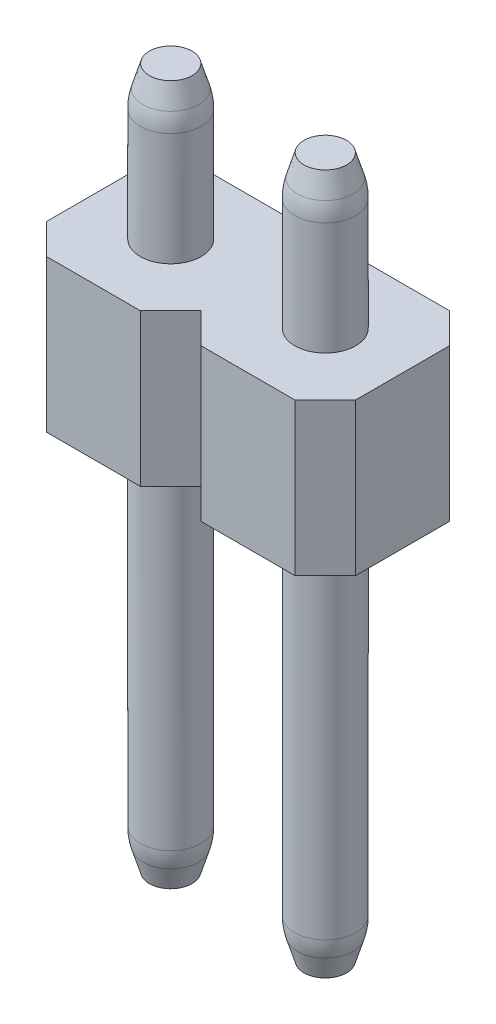
ISO-10303-21;
HEADER;
FILE_DESCRIPTION(('STEP AP214'),'2;1');
FILE_NAME('part.step','',(''),(''),'','','');
FILE_SCHEMA(('AUTOMOTIVE_DESIGN { 1 0 10303 214 1 1 1 1 }'));
ENDSEC;
DATA;
#1=APPLICATION_CONTEXT('core data for automotive mechanical design processes');
#2=APPLICATION_PROTOCOL_DEFINITION('international standard','automotive_design',2000,#1);
#3=PRODUCT_CONTEXT('',#1,'mechanical');
#4=PRODUCT('Part','Part','',(#3));
#5=PRODUCT_RELATED_PRODUCT_CATEGORY('part','',(#4));
#6=PRODUCT_DEFINITION_FORMATION('','',#4);
#7=PRODUCT_DEFINITION_CONTEXT('part definition',#1,'design');
#8=PRODUCT_DEFINITION('design','',#6,#7);
#9=PRODUCT_DEFINITION_SHAPE('','',#8);
#10=(LENGTH_UNIT() NAMED_UNIT(*) SI_UNIT(.MILLI.,.METRE.));
#11=(NAMED_UNIT(*) PLANE_ANGLE_UNIT() SI_UNIT($,.RADIAN.));
#12=(NAMED_UNIT(*) SI_UNIT($,.STERADIAN.) SOLID_ANGLE_UNIT());
#13=UNCERTAINTY_MEASURE_WITH_UNIT(LENGTH_MEASURE(1.E-05),#10,'distance_accuracy_value','');
#14=(GEOMETRIC_REPRESENTATION_CONTEXT(3) GLOBAL_UNCERTAINTY_ASSIGNED_CONTEXT((#13)) GLOBAL_UNIT_ASSIGNED_CONTEXT((#10,
#11,#12)) REPRESENTATION_CONTEXT('',''));
#15=CARTESIAN_POINT('',(0.,0.,0.));
#16=DIRECTION('',(0.,0.,1.));
#17=DIRECTION('',(1.,0.,0.));
#18=AXIS2_PLACEMENT_3D('',#15,#16,#17);
#19=CARTESIAN_POINT('',(0.,11.5,0.));
#20=DIRECTION('',(0.,-1.,0.));
#21=DIRECTION('',(0.,0.,-1.));
#22=AXIS2_PLACEMENT_3D('',#19,#20,#21);
#23=CYLINDRICAL_SURFACE('',#22,0.5);
#24=CARTESIAN_POINT('',(0.,10.8532311636965,0.));
#25=DIRECTION('',(0.,1.,0.));
#26=DIRECTION('',(0.,0.,1.));
#27=AXIS2_PLACEMENT_3D('',#24,#25,#26);
#28=CIRCLE('',#27,0.5);
#29=CARTESIAN_POINT('',(0.,10.8532311636965,0.5));
#30=VERTEX_POINT('',#29);
#31=EDGE_CURVE('E259',#30,#30,#28,.F.);
#32=ORIENTED_EDGE('',*,*,#31,.T.);
#33=EDGE_LOOP('',(#32));
#34=FACE_BOUND('',#33,.T.);
#35=CARTESIAN_POINT('',(0.,9.,0.));
#36=DIRECTION('',(0.,-1.,0.));
#37=DIRECTION('',(0.,0.,-1.));
#38=AXIS2_PLACEMENT_3D('',#35,#36,#37);
#39=CIRCLE('',#38,0.5);
#40=CARTESIAN_POINT('',(0.,9.,-0.5));
#41=VERTEX_POINT('',#40);
#42=EDGE_CURVE('E240',#41,#41,#39,.T.);
#43=ORIENTED_EDGE('',*,*,#42,.F.);
#44=EDGE_LOOP('',(#43));
#45=FACE_BOUND('',#44,.T.);
#46=ADVANCED_FACE('F50',(#34,#45),#23,.T.);
#47=CARTESIAN_POINT('',(0.,11.5,0.));
#48=DIRECTION('',(0.,1.,0.));
#49=DIRECTION('',(0.,0.,1.));
#50=AXIS2_PLACEMENT_3D('',#47,#48,#49);
#51=PLANE('',#50);
#52=CARTESIAN_POINT('',(0.,11.5,0.));
#53=DIRECTION('',(0.,1.,0.));
#54=DIRECTION('',(0.,0.,1.));
#55=AXIS2_PLACEMENT_3D('',#52,#53,#54);
#56=CIRCLE('',#55,0.350000000000005);
#57=CARTESIAN_POINT('',(0.,11.5,0.350000000000005));
#58=VERTEX_POINT('',#57);
#59=EDGE_CURVE('E250',#58,#58,#56,.T.);
#60=ORIENTED_EDGE('',*,*,#59,.T.);
#61=EDGE_LOOP('',(#60));
#62=FACE_BOUND('',#61,.T.);
#63=ADVANCED_FACE('F316',(#62),#51,.T.);
#64=CARTESIAN_POINT('',(-1.27,9.,0.77));
#65=DIRECTION('',(1.,0.,0.));
#66=DIRECTION('',(0.,0.,-1.));
#67=AXIS2_PLACEMENT_3D('',#64,#65,#66);
#68=PLANE('',#67);
#69=DIRECTION('',(0.,0.,1.));
#70=VECTOR('',#69,1.);
#71=CARTESIAN_POINT('',(-1.27,6.5,0.77));
#72=LINE('',#71,#70);
#73=CARTESIAN_POINT('',(-1.27,6.5,-0.77));
#74=VERTEX_POINT('',#73);
#75=CARTESIAN_POINT('',(-1.27,6.5,0.77));
#76=VERTEX_POINT('',#75);
#77=EDGE_CURVE('E179',#74,#76,#72,.T.);
#78=ORIENTED_EDGE('',*,*,#77,.T.);
#79=DIRECTION('',(0.,-1.,0.));
#80=VECTOR('',#79,1.);
#81=CARTESIAN_POINT('',(-1.27,9.,0.77));
#82=LINE('',#81,#80);
#83=CARTESIAN_POINT('',(-1.27,9.,0.77));
#84=VERTEX_POINT('',#83);
#85=EDGE_CURVE('E235',#84,#76,#82,.T.);
#86=ORIENTED_EDGE('',*,*,#85,.F.);
#87=DIRECTION('',(0.,0.,1.));
#88=VECTOR('',#87,1.);
#89=CARTESIAN_POINT('',(-1.27,9.,0.77));
#90=LINE('',#89,#88);
#91=CARTESIAN_POINT('',(-1.27,9.,-0.77));
#92=VERTEX_POINT('',#91);
#93=EDGE_CURVE('E205',#92,#84,#90,.T.);
#94=ORIENTED_EDGE('',*,*,#93,.F.);
#95=DIRECTION('',(0.,-1.,0.));
#96=VECTOR('',#95,1.);
#97=CARTESIAN_POINT('',(-1.27,9.,-0.77));
#98=LINE('',#97,#96);
#99=EDGE_CURVE('E175',#92,#74,#98,.T.);
#100=ORIENTED_EDGE('',*,*,#99,.T.);
#101=EDGE_LOOP('',(#78,#86,#94,#100));
#102=FACE_BOUND('',#101,.T.);
#103=ADVANCED_FACE('F321',(#102),#68,.F.);
#104=CARTESIAN_POINT('',(-1.27,9.,0.77));
#105=DIRECTION('',(0.707106781186548,0.,-0.707106781186548));
#106=DIRECTION('',(-0.707106781186548,0.,-0.707106781186548));
#107=AXIS2_PLACEMENT_3D('',#104,#105,#106);
#108=PLANE('',#107);
#109=DIRECTION('',(0.707106781186548,0.,0.707106781186548));
#110=VECTOR('',#109,1.);
#111=CARTESIAN_POINT('',(-1.27,6.5,0.77));
#112=LINE('',#111,#110);
#113=CARTESIAN_POINT('',(-0.77,6.5,1.27));
#114=VERTEX_POINT('',#113);
#115=EDGE_CURVE('E182',#76,#114,#112,.T.);
#116=ORIENTED_EDGE('',*,*,#115,.T.);
#117=DIRECTION('',(0.,-1.,0.));
#118=VECTOR('',#117,1.);
#119=CARTESIAN_POINT('',(-0.77,9.,1.27));
#120=LINE('',#119,#118);
#121=CARTESIAN_POINT('',(-0.77,9.,1.27));
#122=VERTEX_POINT('',#121);
#123=EDGE_CURVE('E232',#122,#114,#120,.T.);
#124=ORIENTED_EDGE('',*,*,#123,.F.);
#125=DIRECTION('',(0.707106781186548,0.,0.707106781186548));
#126=VECTOR('',#125,1.);
#127=CARTESIAN_POINT('',(-1.27,9.,0.77));
#128=LINE('',#127,#126);
#129=EDGE_CURVE('E127',#84,#122,#128,.T.);
#130=ORIENTED_EDGE('',*,*,#129,.F.);
#131=ORIENTED_EDGE('',*,*,#85,.T.);
#132=EDGE_LOOP('',(#116,#124,#130,#131));
#133=FACE_BOUND('',#132,.T.);
#134=ADVANCED_FACE('F415',(#133),#108,.F.);
#135=CARTESIAN_POINT('',(-0.77,9.,1.27));
#136=DIRECTION('',(0.,0.,-1.));
#137=DIRECTION('',(-1.,0.,0.));
#138=AXIS2_PLACEMENT_3D('',#135,#136,#137);
#139=PLANE('',#138);
#140=DIRECTION('',(1.,0.,0.));
#141=VECTOR('',#140,1.);
#142=CARTESIAN_POINT('',(-0.77,6.5,1.27));
#143=LINE('',#142,#141);
#144=CARTESIAN_POINT('',(0.77,6.5,1.27));
#145=VERTEX_POINT('',#144);
#146=EDGE_CURVE('E185',#114,#145,#143,.T.);
#147=ORIENTED_EDGE('',*,*,#146,.T.);
#148=DIRECTION('',(0.,-1.,0.));
#149=VECTOR('',#148,1.);
#150=CARTESIAN_POINT('',(0.77,9.,1.27));
#151=LINE('',#150,#149);
#152=CARTESIAN_POINT('',(0.77,9.,1.27));
#153=VERTEX_POINT('',#152);
#154=EDGE_CURVE('E229',#153,#145,#151,.T.);
#155=ORIENTED_EDGE('',*,*,#154,.F.);
#156=DIRECTION('',(1.,0.,0.));
#157=VECTOR('',#156,1.);
#158=CARTESIAN_POINT('',(-0.77,9.,1.27));
#159=LINE('',#158,#157);
#160=EDGE_CURVE('E412',#122,#153,#159,.T.);
#161=ORIENTED_EDGE('',*,*,#160,.F.);
#162=ORIENTED_EDGE('',*,*,#123,.T.);
#163=EDGE_LOOP('',(#147,#155,#161,#162));
#164=FACE_BOUND('',#163,.T.);
#165=ADVANCED_FACE('F411',(#164),#139,.F.);
#166=CARTESIAN_POINT('',(0.77,9.,1.27));
#167=DIRECTION('',(-0.707106781186548,0.,-0.707106781186548));
#168=DIRECTION('',(-0.707106781186548,0.,0.707106781186548));
#169=AXIS2_PLACEMENT_3D('',#166,#167,#168);
#170=PLANE('',#169);
#171=DIRECTION('',(0.707106781186548,0.,-0.707106781186548));
#172=VECTOR('',#171,1.);
#173=CARTESIAN_POINT('',(0.77,6.5,1.27));
#174=LINE('',#173,#172);
#175=CARTESIAN_POINT('',(1.27,6.5,0.77));
#176=VERTEX_POINT('',#175);
#177=EDGE_CURVE('E187',#145,#176,#174,.T.);
#178=ORIENTED_EDGE('',*,*,#177,.T.);
#179=DIRECTION('',(0.,-1.,0.));
#180=VECTOR('',#179,1.);
#181=CARTESIAN_POINT('',(1.27,9.,0.77));
#182=LINE('',#181,#180);
#183=CARTESIAN_POINT('',(1.27,9.,0.77));
#184=VERTEX_POINT('',#183);
#185=EDGE_CURVE('E226',#184,#176,#182,.T.);
#186=ORIENTED_EDGE('',*,*,#185,.F.);
#187=DIRECTION('',(0.707106781186548,0.,-0.707106781186548));
#188=VECTOR('',#187,1.);
#189=CARTESIAN_POINT('',(0.77,9.,1.27));
#190=LINE('',#189,#188);
#191=EDGE_CURVE('E407',#153,#184,#190,.T.);
#192=ORIENTED_EDGE('',*,*,#191,.F.);
#193=ORIENTED_EDGE('',*,*,#154,.T.);
#194=EDGE_LOOP('',(#178,#186,#192,#193));
#195=FACE_BOUND('',#194,.T.);
#196=ADVANCED_FACE('F406',(#195),#170,.F.);
#197=CARTESIAN_POINT('',(1.27,9.,0.77));
#198=DIRECTION('',(0.707106781186548,0.,-0.707106781186548));
#199=DIRECTION('',(-0.707106781186548,0.,-0.707106781186548));
#200=AXIS2_PLACEMENT_3D('',#197,#198,#199);
#201=PLANE('',#200);
#202=DIRECTION('',(0.707106781186548,0.,0.707106781186548));
#203=VECTOR('',#202,1.);
#204=CARTESIAN_POINT('',(1.27,6.5,0.77));
#205=LINE('',#204,#203);
#206=CARTESIAN_POINT('',(1.77,6.5,1.27));
#207=VERTEX_POINT('',#206);
#208=EDGE_CURVE('E189',#176,#207,#205,.T.);
#209=ORIENTED_EDGE('',*,*,#208,.T.);
#210=DIRECTION('',(0.,-1.,0.));
#211=VECTOR('',#210,1.);
#212=CARTESIAN_POINT('',(1.77,9.,1.27));
#213=LINE('',#212,#211);
#214=CARTESIAN_POINT('',(1.77,9.,1.27));
#215=VERTEX_POINT('',#214);
#216=EDGE_CURVE('E223',#215,#207,#213,.T.);
#217=ORIENTED_EDGE('',*,*,#216,.F.);
#218=DIRECTION('',(0.707106781186548,0.,0.707106781186548));
#219=VECTOR('',#218,1.);
#220=CARTESIAN_POINT('',(1.27,9.,0.77));
#221=LINE('',#220,#219);
#222=EDGE_CURVE('E403',#184,#215,#221,.T.);
#223=ORIENTED_EDGE('',*,*,#222,.F.);
#224=ORIENTED_EDGE('',*,*,#185,.T.);
#225=EDGE_LOOP('',(#209,#217,#223,#224));
#226=FACE_BOUND('',#225,.T.);
#227=ADVANCED_FACE('F400',(#226),#201,.F.);
#228=CARTESIAN_POINT('',(1.77,9.,1.27));
#229=DIRECTION('',(0.,0.,-1.));
#230=DIRECTION('',(-1.,0.,0.));
#231=AXIS2_PLACEMENT_3D('',#228,#229,#230);
#232=PLANE('',#231);
#233=DIRECTION('',(1.,0.,0.));
#234=VECTOR('',#233,1.);
#235=CARTESIAN_POINT('',(1.77,6.5,1.27));
#236=LINE('',#235,#234);
#237=CARTESIAN_POINT('',(3.31,6.5,1.27));
#238=VERTEX_POINT('',#237);
#239=EDGE_CURVE('E191',#207,#238,#236,.T.);
#240=ORIENTED_EDGE('',*,*,#239,.T.);
#241=DIRECTION('',(0.,-1.,0.));
#242=VECTOR('',#241,1.);
#243=CARTESIAN_POINT('',(3.31,9.,1.27));
#244=LINE('',#243,#242);
#245=CARTESIAN_POINT('',(3.31,9.,1.27));
#246=VERTEX_POINT('',#245);
#247=EDGE_CURVE('E220',#246,#238,#244,.T.);
#248=ORIENTED_EDGE('',*,*,#247,.F.);
#249=DIRECTION('',(1.,0.,0.));
#250=VECTOR('',#249,1.);
#251=CARTESIAN_POINT('',(1.77,9.,1.27));
#252=LINE('',#251,#250);
#253=EDGE_CURVE('E394',#215,#246,#252,.T.);
#254=ORIENTED_EDGE('',*,*,#253,.F.);
#255=ORIENTED_EDGE('',*,*,#216,.T.);
#256=EDGE_LOOP('',(#240,#248,#254,#255));
#257=FACE_BOUND('',#256,.T.);
#258=ADVANCED_FACE('F393',(#257),#232,.F.);
#259=CARTESIAN_POINT('',(3.31,9.,1.27));
#260=DIRECTION('',(-0.707106781186548,0.,-0.707106781186548));
#261=DIRECTION('',(-0.707106781186548,0.,0.707106781186548));
#262=AXIS2_PLACEMENT_3D('',#259,#260,#261);
#263=PLANE('',#262);
#264=DIRECTION('',(0.707106781186548,0.,-0.707106781186548));
#265=VECTOR('',#264,1.);
#266=CARTESIAN_POINT('',(3.31,6.5,1.27));
#267=LINE('',#266,#265);
#268=CARTESIAN_POINT('',(3.81,6.5,0.77));
#269=VERTEX_POINT('',#268);
#270=EDGE_CURVE('E193',#238,#269,#267,.T.);
#271=ORIENTED_EDGE('',*,*,#270,.T.);
#272=DIRECTION('',(0.,-1.,0.));
#273=VECTOR('',#272,1.);
#274=CARTESIAN_POINT('',(3.81,9.,0.77));
#275=LINE('',#274,#273);
#276=CARTESIAN_POINT('',(3.81,9.,0.77));
#277=VERTEX_POINT('',#276);
#278=EDGE_CURVE('E218',#277,#269,#275,.T.);
#279=ORIENTED_EDGE('',*,*,#278,.F.);
#280=DIRECTION('',(0.707106781186548,0.,-0.707106781186548));
#281=VECTOR('',#280,1.);
#282=CARTESIAN_POINT('',(3.31,9.,1.27));
#283=LINE('',#282,#281);
#284=EDGE_CURVE('E390',#246,#277,#283,.T.);
#285=ORIENTED_EDGE('',*,*,#284,.F.);
#286=ORIENTED_EDGE('',*,*,#247,.T.);
#287=EDGE_LOOP('',(#271,#279,#285,#286));
#288=FACE_BOUND('',#287,.T.);
#289=ADVANCED_FACE('F388',(#288),#263,.F.);
#290=CARTESIAN_POINT('',(3.31,9.,-1.27));
#291=DIRECTION('',(-0.707106781186548,0.,0.707106781186548));
#292=DIRECTION('',(0.707106781186548,0.,0.707106781186548));
#293=AXIS2_PLACEMENT_3D('',#290,#291,#292);
#294=PLANE('',#293);
#295=DIRECTION('',(-0.707106781186548,0.,-0.707106781186548));
#296=VECTOR('',#295,1.);
#297=CARTESIAN_POINT('',(3.31,6.5,-1.27));
#298=LINE('',#297,#296);
#299=CARTESIAN_POINT('',(3.81,6.5,-0.77));
#300=VERTEX_POINT('',#299);
#301=CARTESIAN_POINT('',(3.31,6.5,-1.27));
#302=VERTEX_POINT('',#301);
#303=EDGE_CURVE('E196',#300,#302,#298,.T.);
#304=ORIENTED_EDGE('',*,*,#303,.T.);
#305=DIRECTION('',(0.,-1.,0.));
#306=VECTOR('',#305,1.);
#307=CARTESIAN_POINT('',(3.31,9.,-1.27));
#308=LINE('',#307,#306);
#309=CARTESIAN_POINT('',(3.31,9.,-1.27));
#310=VERTEX_POINT('',#309);
#311=EDGE_CURVE('E212',#310,#302,#308,.T.);
#312=ORIENTED_EDGE('',*,*,#311,.F.);
#313=DIRECTION('',(-0.707106781186548,0.,-0.707106781186548));
#314=VECTOR('',#313,1.);
#315=CARTESIAN_POINT('',(3.31,9.,-1.27));
#316=LINE('',#315,#314);
#317=CARTESIAN_POINT('',(3.81,9.,-0.77));
#318=VERTEX_POINT('',#317);
#319=EDGE_CURVE('E431',#318,#310,#316,.T.);
#320=ORIENTED_EDGE('',*,*,#319,.F.);
#321=DIRECTION('',(0.,-1.,0.));
#322=VECTOR('',#321,1.);
#323=CARTESIAN_POINT('',(3.81,9.,-0.77));
#324=LINE('',#323,#322);
#325=EDGE_CURVE('E215',#318,#300,#324,.T.);
#326=ORIENTED_EDGE('',*,*,#325,.T.);
#327=EDGE_LOOP('',(#304,#312,#320,#326));
#328=FACE_BOUND('',#327,.T.);
#329=ADVANCED_FACE('F429',(#328),#294,.F.);
#330=CARTESIAN_POINT('',(1.77,9.,-1.27));
#331=DIRECTION('',(0.,0.,1.));
#332=DIRECTION('',(1.,0.,0.));
#333=AXIS2_PLACEMENT_3D('',#330,#331,#332);
#334=PLANE('',#333);
#335=DIRECTION('',(-1.,0.,0.));
#336=VECTOR('',#335,1.);
#337=CARTESIAN_POINT('',(1.77,6.5,-1.27));
#338=LINE('',#337,#336);
#339=CARTESIAN_POINT('',(1.77,6.5,-1.27));
#340=VERTEX_POINT('',#339);
#341=EDGE_CURVE('E198',#302,#340,#338,.T.);
#342=ORIENTED_EDGE('',*,*,#341,.T.);
#343=DIRECTION('',(0.,-1.,0.));
#344=VECTOR('',#343,1.);
#345=CARTESIAN_POINT('',(1.77,9.,-1.27));
#346=LINE('',#345,#344);
#347=CARTESIAN_POINT('',(1.77,9.,-1.27));
#348=VERTEX_POINT('',#347);
#349=EDGE_CURVE('E209',#348,#340,#346,.T.);
#350=ORIENTED_EDGE('',*,*,#349,.F.);
#351=DIRECTION('',(-1.,0.,0.));
#352=VECTOR('',#351,1.);
#353=CARTESIAN_POINT('',(1.77,9.,-1.27));
#354=LINE('',#353,#352);
#355=EDGE_CURVE('E425',#310,#348,#354,.T.);
#356=ORIENTED_EDGE('',*,*,#355,.F.);
#357=ORIENTED_EDGE('',*,*,#311,.T.);
#358=EDGE_LOOP('',(#342,#350,#356,#357));
#359=FACE_BOUND('',#358,.T.);
#360=ADVANCED_FACE('F424',(#359),#334,.F.);
#361=CARTESIAN_POINT('',(1.27,9.,-0.77));
#362=DIRECTION('',(0.707106781186548,0.,0.707106781186548));
#363=DIRECTION('',(0.707106781186548,0.,-0.707106781186548));
#364=AXIS2_PLACEMENT_3D('',#361,#362,#363);
#365=PLANE('',#364);
#366=DIRECTION('',(-0.707106781186548,0.,0.707106781186548));
#367=VECTOR('',#366,1.);
#368=CARTESIAN_POINT('',(1.27,6.5,-0.77));
#369=LINE('',#368,#367);
#370=CARTESIAN_POINT('',(1.27,6.5,-0.77));
#371=VERTEX_POINT('',#370);
#372=EDGE_CURVE('E200',#340,#371,#369,.T.);
#373=ORIENTED_EDGE('',*,*,#372,.T.);
#374=DIRECTION('',(0.,-1.,0.));
#375=VECTOR('',#374,1.);
#376=CARTESIAN_POINT('',(1.27,9.,-0.77));
#377=LINE('',#376,#375);
#378=CARTESIAN_POINT('',(1.27,9.,-0.77));
#379=VERTEX_POINT('',#378);
#380=EDGE_CURVE('E170',#379,#371,#377,.T.);
#381=ORIENTED_EDGE('',*,*,#380,.F.);
#382=DIRECTION('',(-0.707106781186548,0.,0.707106781186548));
#383=VECTOR('',#382,1.);
#384=CARTESIAN_POINT('',(1.27,9.,-0.77));
#385=LINE('',#384,#383);
#386=EDGE_CURVE('E161',#348,#379,#385,.T.);
#387=ORIENTED_EDGE('',*,*,#386,.F.);
#388=ORIENTED_EDGE('',*,*,#349,.T.);
#389=EDGE_LOOP('',(#373,#381,#387,#388));
#390=FACE_BOUND('',#389,.T.);
#391=ADVANCED_FACE('F420',(#390),#365,.F.);
#392=CARTESIAN_POINT('',(0.77,9.,-1.27));
#393=DIRECTION('',(-0.707106781186548,0.,0.707106781186548));
#394=DIRECTION('',(0.707106781186548,0.,0.707106781186548));
#395=AXIS2_PLACEMENT_3D('',#392,#393,#394);
#396=PLANE('',#395);
#397=DIRECTION('',(-0.707106781186548,0.,-0.707106781186548));
#398=VECTOR('',#397,1.);
#399=CARTESIAN_POINT('',(0.77,6.5,-1.27));
#400=LINE('',#399,#398);
#401=CARTESIAN_POINT('',(0.77,6.5,-1.27));
#402=VERTEX_POINT('',#401);
#403=EDGE_CURVE('E169',#371,#402,#400,.T.);
#404=ORIENTED_EDGE('',*,*,#403,.T.);
#405=DIRECTION('',(0.,-1.,0.));
#406=VECTOR('',#405,1.);
#407=CARTESIAN_POINT('',(0.77,9.,-1.27));
#408=LINE('',#407,#406);
#409=CARTESIAN_POINT('',(0.77,9.,-1.27));
#410=VERTEX_POINT('',#409);
#411=EDGE_CURVE('E166',#410,#402,#408,.T.);
#412=ORIENTED_EDGE('',*,*,#411,.F.);
#413=DIRECTION('',(-0.707106781186548,0.,-0.707106781186548));
#414=VECTOR('',#413,1.);
#415=CARTESIAN_POINT('',(0.77,9.,-1.27));
#416=LINE('',#415,#414);
#417=EDGE_CURVE('E154',#379,#410,#416,.T.);
#418=ORIENTED_EDGE('',*,*,#417,.F.);
#419=ORIENTED_EDGE('',*,*,#380,.T.);
#420=EDGE_LOOP('',(#404,#412,#418,#419));
#421=FACE_BOUND('',#420,.T.);
#422=ADVANCED_FACE('F167',(#421),#396,.F.);
#423=CARTESIAN_POINT('',(-0.77,9.,-1.27));
#424=DIRECTION('',(0.,0.,1.));
#425=DIRECTION('',(1.,0.,0.));
#426=AXIS2_PLACEMENT_3D('',#423,#424,#425);
#427=PLANE('',#426);
#428=DIRECTION('',(-1.,0.,0.));
#429=VECTOR('',#428,1.);
#430=CARTESIAN_POINT('',(-0.77,6.5,-1.27));
#431=LINE('',#430,#429);
#432=CARTESIAN_POINT('',(-0.77,6.5,-1.27));
#433=VERTEX_POINT('',#432);
#434=EDGE_CURVE('E112',#402,#433,#431,.T.);
#435=ORIENTED_EDGE('',*,*,#434,.T.);
#436=DIRECTION('',(0.,-1.,0.));
#437=VECTOR('',#436,1.);
#438=CARTESIAN_POINT('',(-0.77,9.,-1.27));
#439=LINE('',#438,#437);
#440=CARTESIAN_POINT('',(-0.77,9.,-1.27));
#441=VERTEX_POINT('',#440);
#442=EDGE_CURVE('E171',#441,#433,#439,.T.);
#443=ORIENTED_EDGE('',*,*,#442,.F.);
#444=DIRECTION('',(-1.,0.,0.));
#445=VECTOR('',#444,1.);
#446=CARTESIAN_POINT('',(-0.77,9.,-1.27));
#447=LINE('',#446,#445);
#448=EDGE_CURVE('E159',#410,#441,#447,.T.);
#449=ORIENTED_EDGE('',*,*,#448,.F.);
#450=ORIENTED_EDGE('',*,*,#411,.T.);
#451=EDGE_LOOP('',(#435,#443,#449,#450));
#452=FACE_BOUND('',#451,.T.);
#453=ADVANCED_FACE('F173',(#452),#427,.F.);
#454=CARTESIAN_POINT('',(-1.27,9.,-0.77));
#455=DIRECTION('',(0.707106781186548,0.,0.707106781186548));
#456=DIRECTION('',(0.707106781186548,0.,-0.707106781186548));
#457=AXIS2_PLACEMENT_3D('',#454,#455,#456);
#458=PLANE('',#457);
#459=DIRECTION('',(-0.707106781186548,0.,0.707106781186548));
#460=VECTOR('',#459,1.);
#461=CARTESIAN_POINT('',(-1.27,6.5,-0.77));
#462=LINE('',#461,#460);
#463=EDGE_CURVE('E118',#433,#74,#462,.T.);
#464=ORIENTED_EDGE('',*,*,#463,.T.);
#465=ORIENTED_EDGE('',*,*,#99,.F.);
#466=DIRECTION('',(-0.707106781186548,0.,0.707106781186548));
#467=VECTOR('',#466,1.);
#468=CARTESIAN_POINT('',(-1.27,9.,-0.77));
#469=LINE('',#468,#467);
#470=EDGE_CURVE('E67',#441,#92,#469,.T.);
#471=ORIENTED_EDGE('',*,*,#470,.F.);
#472=ORIENTED_EDGE('',*,*,#442,.T.);
#473=EDGE_LOOP('',(#464,#465,#471,#472));
#474=FACE_BOUND('',#473,.T.);
#475=ADVANCED_FACE('F309',(#474),#458,.F.);
#476=CARTESIAN_POINT('',(0.,9.,0.));
#477=DIRECTION('',(0.,-1.,0.));
#478=DIRECTION('',(0.,0.,-1.));
#479=AXIS2_PLACEMENT_3D('',#476,#477,#478);
#480=PLANE('',#479);
#481=CARTESIAN_POINT('',(2.54,9.,0.));
#482=DIRECTION('',(0.,-1.,0.));
#483=DIRECTION('',(0.,0.,-1.));
#484=AXIS2_PLACEMENT_3D('',#481,#482,#483);
#485=CIRCLE('',#484,0.5);
#486=CARTESIAN_POINT('',(2.54,9.,-0.5));
#487=VERTEX_POINT('',#486);
#488=EDGE_CURVE('E243',#487,#487,#485,.F.);
#489=ORIENTED_EDGE('',*,*,#488,.F.);
#490=EDGE_LOOP('',(#489));
#491=FACE_BOUND('',#490,.T.);
#492=ORIENTED_EDGE('',*,*,#42,.T.);
#493=EDGE_LOOP('',(#492));
#494=FACE_BOUND('',#493,.T.);
#495=ORIENTED_EDGE('',*,*,#284,.T.);
#496=DIRECTION('',(0.,0.,-1.));
#497=VECTOR('',#496,1.);
#498=CARTESIAN_POINT('',(3.81,9.,0.));
#499=LINE('',#498,#497);
#500=EDGE_CURVE('E246',#277,#318,#499,.T.);
#501=ORIENTED_EDGE('',*,*,#500,.T.);
#502=ORIENTED_EDGE('',*,*,#319,.T.);
#503=ORIENTED_EDGE('',*,*,#355,.T.);
#504=ORIENTED_EDGE('',*,*,#386,.T.);
#505=ORIENTED_EDGE('',*,*,#417,.T.);
#506=ORIENTED_EDGE('',*,*,#448,.T.);
#507=ORIENTED_EDGE('',*,*,#470,.T.);
#508=ORIENTED_EDGE('',*,*,#93,.T.);
#509=ORIENTED_EDGE('',*,*,#129,.T.);
#510=ORIENTED_EDGE('',*,*,#160,.T.);
#511=ORIENTED_EDGE('',*,*,#191,.T.);
#512=ORIENTED_EDGE('',*,*,#222,.T.);
#513=ORIENTED_EDGE('',*,*,#253,.T.);
#514=EDGE_LOOP('',(#495,#501,#502,#503,#504,#505,#506,#507,#508,#509,#510,#511,#512,#513));
#515=FACE_BOUND('',#514,.T.);
#516=ADVANCED_FACE('F157',(#491,#494,#515),#480,.F.);
#517=CARTESIAN_POINT('',(0.,6.5,0.));
#518=DIRECTION('',(0.,-1.,0.));
#519=DIRECTION('',(0.,0.,-1.));
#520=AXIS2_PLACEMENT_3D('',#517,#518,#519);
#521=PLANE('',#520);
#522=DIRECTION('',(0.,0.,-1.));
#523=VECTOR('',#522,1.);
#524=CARTESIAN_POINT('',(3.81,6.5,0.));
#525=LINE('',#524,#523);
#526=EDGE_CURVE('E13',#269,#300,#525,.T.);
#527=ORIENTED_EDGE('',*,*,#526,.F.);
#528=ORIENTED_EDGE('',*,*,#270,.F.);
#529=ORIENTED_EDGE('',*,*,#239,.F.);
#530=ORIENTED_EDGE('',*,*,#208,.F.);
#531=ORIENTED_EDGE('',*,*,#177,.F.);
#532=ORIENTED_EDGE('',*,*,#146,.F.);
#533=ORIENTED_EDGE('',*,*,#115,.F.);
#534=ORIENTED_EDGE('',*,*,#77,.F.);
#535=ORIENTED_EDGE('',*,*,#463,.F.);
#536=ORIENTED_EDGE('',*,*,#434,.F.);
#537=ORIENTED_EDGE('',*,*,#403,.F.);
#538=ORIENTED_EDGE('',*,*,#372,.F.);
#539=ORIENTED_EDGE('',*,*,#341,.F.);
#540=ORIENTED_EDGE('',*,*,#303,.F.);
#541=EDGE_LOOP('',(#527,#528,#529,#530,#531,#532,#533,#534,#535,#536,#537,#538,#539,#540));
#542=FACE_BOUND('',#541,.T.);
#543=CARTESIAN_POINT('',(2.54,6.5,0.));
#544=DIRECTION('',(0.,-1.,0.));
#545=DIRECTION('',(0.,0.,-1.));
#546=AXIS2_PLACEMENT_3D('',#543,#544,#545);
#547=CIRCLE('',#546,0.5);
#548=CARTESIAN_POINT('',(2.54,6.5,-0.5));
#549=VERTEX_POINT('',#548);
#550=EDGE_CURVE('E183',#549,#549,#547,.F.);
#551=ORIENTED_EDGE('',*,*,#550,.T.);
#552=EDGE_LOOP('',(#551));
#553=FACE_BOUND('',#552,.T.);
#554=CARTESIAN_POINT('',(0.,6.5,0.));
#555=DIRECTION('',(0.,-1.,0.));
#556=DIRECTION('',(0.,0.,-1.));
#557=AXIS2_PLACEMENT_3D('',#554,#555,#556);
#558=CIRCLE('',#557,0.5);
#559=CARTESIAN_POINT('',(0.,6.5,-0.5));
#560=VERTEX_POINT('',#559);
#561=EDGE_CURVE('E237',#560,#560,#558,.T.);
#562=ORIENTED_EDGE('',*,*,#561,.F.);
#563=EDGE_LOOP('',(#562));
#564=FACE_BOUND('',#563,.T.);
#565=ADVANCED_FACE('F299',(#542,#553,#564),#521,.T.);
#566=CARTESIAN_POINT('',(0.,0.,0.));
#567=DIRECTION('',(0.,1.,0.));
#568=DIRECTION('',(0.,0.,1.));
#569=AXIS2_PLACEMENT_3D('',#566,#567,#568);
#570=PLANE('',#569);
#571=CARTESIAN_POINT('',(0.,0.,0.));
#572=DIRECTION('',(0.,1.,0.));
#573=DIRECTION('',(0.,0.,1.));
#574=AXIS2_PLACEMENT_3D('',#571,#572,#573);
#575=CIRCLE('',#574,0.349999999999994);
#576=CARTESIAN_POINT('',(0.,0.,0.349999999999994));
#577=VERTEX_POINT('',#576);
#578=EDGE_CURVE('E265',#577,#577,#575,.F.);
#579=ORIENTED_EDGE('',*,*,#578,.T.);
#580=EDGE_LOOP('',(#579));
#581=FACE_BOUND('',#580,.T.);
#582=ADVANCED_FACE('F295',(#581),#570,.F.);
#583=CARTESIAN_POINT('',(0.,0.646768836303538,0.));
#584=DIRECTION('',(0.,-1.,0.));
#585=DIRECTION('',(0.,0.,-1.));
#586=AXIS2_PLACEMENT_3D('',#583,#584,#585);
#587=CIRCLE('',#586,0.5);
#588=CARTESIAN_POINT('',(0.,0.646768836303538,-0.5));
#589=VERTEX_POINT('',#588);
#590=EDGE_CURVE('E277',#589,#589,#587,.F.);
#591=ORIENTED_EDGE('',*,*,#590,.T.);
#592=EDGE_LOOP('',(#591));
#593=FACE_BOUND('',#592,.T.);
#594=ORIENTED_EDGE('',*,*,#561,.T.);
#595=EDGE_LOOP('',(#594));
#596=FACE_BOUND('',#595,.T.);
#597=ADVANCED_FACE('F291',(#593,#596),#23,.T.);
#598=CARTESIAN_POINT('',(2.54,0.,0.));
#599=DIRECTION('',(0.,1.,0.));
#600=DIRECTION('',(0.,0.,1.));
#601=AXIS2_PLACEMENT_3D('',#598,#599,#600);
#602=PLANE('',#601);
#603=CARTESIAN_POINT('',(2.54,0.,0.));
#604=DIRECTION('',(0.,1.,0.));
#605=DIRECTION('',(0.,0.,1.));
#606=AXIS2_PLACEMENT_3D('',#603,#604,#605);
#607=CIRCLE('',#606,0.349999999999994);
#608=CARTESIAN_POINT('',(2.54,0.,0.349999999999994));
#609=VERTEX_POINT('',#608);
#610=EDGE_CURVE('E268',#609,#609,#607,.F.);
#611=ORIENTED_EDGE('',*,*,#610,.T.);
#612=EDGE_LOOP('',(#611));
#613=FACE_BOUND('',#612,.T.);
#614=ADVANCED_FACE('F294',(#613),#602,.F.);
#615=CARTESIAN_POINT('',(2.54,11.5,0.));
#616=DIRECTION('',(0.,-1.,0.));
#617=DIRECTION('',(0.,0.,-1.));
#618=AXIS2_PLACEMENT_3D('',#615,#616,#617);
#619=CYLINDRICAL_SURFACE('',#618,0.5);
#620=CARTESIAN_POINT('',(2.54,0.646768836303539,0.));
#621=DIRECTION('',(0.,-1.,0.));
#622=DIRECTION('',(0.,0.,-1.));
#623=AXIS2_PLACEMENT_3D('',#620,#621,#622);
#624=CIRCLE('',#623,0.5);
#625=CARTESIAN_POINT('',(2.54,0.646768836303539,-0.5));
#626=VERTEX_POINT('',#625);
#627=EDGE_CURVE('E271',#626,#626,#624,.F.);
#628=ORIENTED_EDGE('',*,*,#627,.T.);
#629=EDGE_LOOP('',(#628));
#630=FACE_BOUND('',#629,.T.);
#631=ORIENTED_EDGE('',*,*,#550,.F.);
#632=EDGE_LOOP('',(#631));
#633=FACE_BOUND('',#632,.T.);
#634=ADVANCED_FACE('F356',(#630,#633),#619,.T.);
#635=CARTESIAN_POINT('',(2.54,10.8532311636965,0.));
#636=DIRECTION('',(0.,1.,0.));
#637=DIRECTION('',(0.,0.,1.));
#638=AXIS2_PLACEMENT_3D('',#635,#636,#637);
#639=CIRCLE('',#638,0.5);
#640=CARTESIAN_POINT('',(2.54,10.8532311636965,0.5));
#641=VERTEX_POINT('',#640);
#642=EDGE_CURVE('E253',#641,#641,#639,.F.);
#643=ORIENTED_EDGE('',*,*,#642,.T.);
#644=EDGE_LOOP('',(#643));
#645=FACE_BOUND('',#644,.T.);
#646=ORIENTED_EDGE('',*,*,#488,.T.);
#647=EDGE_LOOP('',(#646));
#648=FACE_BOUND('',#647,.T.);
#649=ADVANCED_FACE('F359',(#645,#648),#619,.T.);
#650=CARTESIAN_POINT('',(2.54,11.5,0.));
#651=DIRECTION('',(0.,1.,0.));
#652=DIRECTION('',(0.,0.,1.));
#653=AXIS2_PLACEMENT_3D('',#650,#651,#652);
#654=PLANE('',#653);
#655=CARTESIAN_POINT('',(2.54,11.5,0.));
#656=DIRECTION('',(0.,1.,0.));
#657=DIRECTION('',(0.,0.,1.));
#658=AXIS2_PLACEMENT_3D('',#655,#656,#657);
#659=CIRCLE('',#658,0.350000000000005);
#660=CARTESIAN_POINT('',(2.54,11.5,0.350000000000005));
#661=VERTEX_POINT('',#660);
#662=EDGE_CURVE('E247',#661,#661,#659,.T.);
#663=ORIENTED_EDGE('',*,*,#662,.T.);
#664=EDGE_LOOP('',(#663));
#665=FACE_BOUND('',#664,.T.);
#666=ADVANCED_FACE('F330',(#665),#654,.T.);
#667=CARTESIAN_POINT('',(2.54,11.5,0.));
#668=DIRECTION('',(0.,-1.,0.));
#669=DIRECTION('',(0.,0.,-1.));
#670=AXIS2_PLACEMENT_3D('',#667,#668,#669);
#671=CONICAL_SURFACE('',#670,0.350000000000005,0.291456794477863);
#672=CARTESIAN_POINT('',(2.54,11.1405790492628,0.));
#673=DIRECTION('',(0.,-1.,0.));
#674=DIRECTION('',(0.,0.,-1.));
#675=AXIS2_PLACEMENT_3D('',#672,#673,#674);
#676=CIRCLE('',#675,0.457826285221152);
#677=CARTESIAN_POINT('',(2.54,11.1405790492628,-0.457826285221152));
#678=VERTEX_POINT('',#677);
#679=EDGE_CURVE('E256',#678,#678,#676,.F.);
#680=ORIENTED_EDGE('',*,*,#679,.T.);
#681=EDGE_LOOP('',(#680));
#682=FACE_BOUND('',#681,.T.);
#683=ORIENTED_EDGE('',*,*,#662,.F.);
#684=EDGE_LOOP('',(#683));
#685=FACE_BOUND('',#684,.T.);
#686=ADVANCED_FACE('F326',(#682,#685),#671,.T.);
#687=CARTESIAN_POINT('',(0.,11.5,0.));
#688=DIRECTION('',(0.,-1.,0.));
#689=DIRECTION('',(0.,0.,-1.));
#690=AXIS2_PLACEMENT_3D('',#687,#688,#689);
#691=CONICAL_SURFACE('',#690,0.350000000000005,0.291456794477864);
#692=CARTESIAN_POINT('',(0.,11.1405790492628,0.));
#693=DIRECTION('',(0.,-1.,0.));
#694=DIRECTION('',(0.,0.,-1.));
#695=AXIS2_PLACEMENT_3D('',#692,#693,#694);
#696=CIRCLE('',#695,0.457826285221153);
#697=CARTESIAN_POINT('',(0.,11.1405790492628,-0.457826285221153));
#698=VERTEX_POINT('',#697);
#699=EDGE_CURVE('E262',#698,#698,#696,.F.);
#700=ORIENTED_EDGE('',*,*,#699,.T.);
#701=EDGE_LOOP('',(#700));
#702=FACE_BOUND('',#701,.T.);
#703=ORIENTED_EDGE('',*,*,#59,.F.);
#704=EDGE_LOOP('',(#703));
#705=FACE_BOUND('',#704,.T.);
#706=ADVANCED_FACE('F329',(#702,#705),#691,.T.);
#707=CARTESIAN_POINT('',(2.54,10.8532311636965,0.));
#708=DIRECTION('',(0.,1.,0.));
#709=DIRECTION('',(0.,0.,1.));
#710=AXIS2_PLACEMENT_3D('',#707,#708,#709);
#711=DEGENERATE_TOROIDAL_SURFACE('',#710,0.5,1.,.F.);
#712=ORIENTED_EDGE('',*,*,#679,.F.);
#713=EDGE_LOOP('',(#712));
#714=FACE_BOUND('',#713,.T.);
#715=ORIENTED_EDGE('',*,*,#642,.F.);
#716=EDGE_LOOP('',(#715));
#717=FACE_BOUND('',#716,.T.);
#718=ADVANCED_FACE('F334',(#714,#717),#711,.F.);
#719=CARTESIAN_POINT('',(0.,10.8532311636965,0.));
#720=DIRECTION('',(0.,1.,0.));
#721=DIRECTION('',(0.,0.,1.));
#722=AXIS2_PLACEMENT_3D('',#719,#720,#721);
#723=DEGENERATE_TOROIDAL_SURFACE('',#722,0.5,1.,.F.);
#724=ORIENTED_EDGE('',*,*,#699,.F.);
#725=EDGE_LOOP('',(#724));
#726=FACE_BOUND('',#725,.T.);
#727=ORIENTED_EDGE('',*,*,#31,.F.);
#728=EDGE_LOOP('',(#727));
#729=FACE_BOUND('',#728,.T.);
#730=ADVANCED_FACE('F338',(#726,#729),#723,.F.);
#731=CARTESIAN_POINT('',(0.,0.500000000000021,0.));
#732=DIRECTION('',(0.,1.,0.));
#733=DIRECTION('',(0.,0.,1.));
#734=AXIS2_PLACEMENT_3D('',#731,#732,#733);
#735=CONICAL_SURFACE('',#734,0.5,0.291456794477866);
#736=CARTESIAN_POINT('',(0.,0.359420950737193,0.));
#737=DIRECTION('',(0.,1.,0.));
#738=DIRECTION('',(0.,0.,1.));
#739=AXIS2_PLACEMENT_3D('',#736,#737,#738);
#740=CIRCLE('',#739,0.457826285221152);
#741=CARTESIAN_POINT('',(0.,0.359420950737193,0.457826285221152));
#742=VERTEX_POINT('',#741);
#743=EDGE_CURVE('E59',#742,#742,#740,.F.);
#744=ORIENTED_EDGE('',*,*,#743,.T.);
#745=EDGE_LOOP('',(#744));
#746=FACE_BOUND('',#745,.T.);
#747=ORIENTED_EDGE('',*,*,#578,.F.);
#748=EDGE_LOOP('',(#747));
#749=FACE_BOUND('',#748,.T.);
#750=ADVANCED_FACE('F282',(#746,#749),#735,.T.);
#751=CARTESIAN_POINT('',(2.54,0.500000000000023,0.));
#752=DIRECTION('',(0.,1.,0.));
#753=DIRECTION('',(0.,0.,1.));
#754=AXIS2_PLACEMENT_3D('',#751,#752,#753);
#755=CONICAL_SURFACE('',#754,0.5,0.291456794477865);
#756=CARTESIAN_POINT('',(2.54,0.359420950737196,0.));
#757=DIRECTION('',(0.,1.,0.));
#758=DIRECTION('',(0.,0.,1.));
#759=AXIS2_PLACEMENT_3D('',#756,#757,#758);
#760=CIRCLE('',#759,0.457826285221152);
#761=CARTESIAN_POINT('',(2.54,0.359420950737196,0.457826285221152));
#762=VERTEX_POINT('',#761);
#763=EDGE_CURVE('E274',#762,#762,#760,.F.);
#764=ORIENTED_EDGE('',*,*,#763,.T.);
#765=EDGE_LOOP('',(#764));
#766=FACE_BOUND('',#765,.T.);
#767=ORIENTED_EDGE('',*,*,#610,.F.);
#768=EDGE_LOOP('',(#767));
#769=FACE_BOUND('',#768,.T.);
#770=ADVANCED_FACE('F345',(#766,#769),#755,.T.);
#771=CARTESIAN_POINT('',(2.54,0.646768836303539,0.));
#772=DIRECTION('',(0.,-1.,0.));
#773=DIRECTION('',(0.,0.,-1.));
#774=AXIS2_PLACEMENT_3D('',#771,#772,#773);
#775=DEGENERATE_TOROIDAL_SURFACE('',#774,0.5,1.,.F.);
#776=ORIENTED_EDGE('',*,*,#763,.F.);
#777=EDGE_LOOP('',(#776));
#778=FACE_BOUND('',#777,.T.);
#779=ORIENTED_EDGE('',*,*,#627,.F.);
#780=EDGE_LOOP('',(#779));
#781=FACE_BOUND('',#780,.T.);
#782=ADVANCED_FACE('F288',(#778,#781),#775,.F.);
#783=CARTESIAN_POINT('',(0.,0.646768836303538,0.));
#784=DIRECTION('',(0.,-1.,0.));
#785=DIRECTION('',(0.,0.,-1.));
#786=AXIS2_PLACEMENT_3D('',#783,#784,#785);
#787=DEGENERATE_TOROIDAL_SURFACE('',#786,0.5,1.,.F.);
#788=ORIENTED_EDGE('',*,*,#743,.F.);
#789=EDGE_LOOP('',(#788));
#790=FACE_BOUND('',#789,.T.);
#791=ORIENTED_EDGE('',*,*,#590,.F.);
#792=EDGE_LOOP('',(#791));
#793=FACE_BOUND('',#792,.T.);
#794=ADVANCED_FACE('F52',(#790,#793),#787,.F.);
#795=CARTESIAN_POINT('',(3.81,11.5,-1.27));
#796=DIRECTION('',(-1.,0.,0.));
#797=DIRECTION('',(0.,0.,1.));
#798=AXIS2_PLACEMENT_3D('',#795,#796,#797);
#799=PLANE('',#798);
#800=ORIENTED_EDGE('',*,*,#278,.T.);
#801=ORIENTED_EDGE('',*,*,#526,.T.);
#802=ORIENTED_EDGE('',*,*,#325,.F.);
#803=ORIENTED_EDGE('',*,*,#500,.F.);
#804=EDGE_LOOP('',(#800,#801,#802,#803));
#805=FACE_BOUND('',#804,.T.);
#806=ADVANCED_FACE('F287',(#805),#799,.F.);
#807=CLOSED_SHELL('',(#46,#63,#103,#134,#165,#196,#227,#258,#289,#329,#360,#391,#422,#453,#475,
#516,#565,#582,#597,#614,#634,#649,#666,#686,#706,#718,#730,#750,#770,#782,#794,#806));
#808=MANIFOLD_SOLID_BREP('B2',#807);
#809=ADVANCED_BREP_SHAPE_REPRESENTATION('',(#18,#808),#14);
#810=SHAPE_DEFINITION_REPRESENTATION(#9,#809);
ENDSEC;
END-ISO-10303-21;
